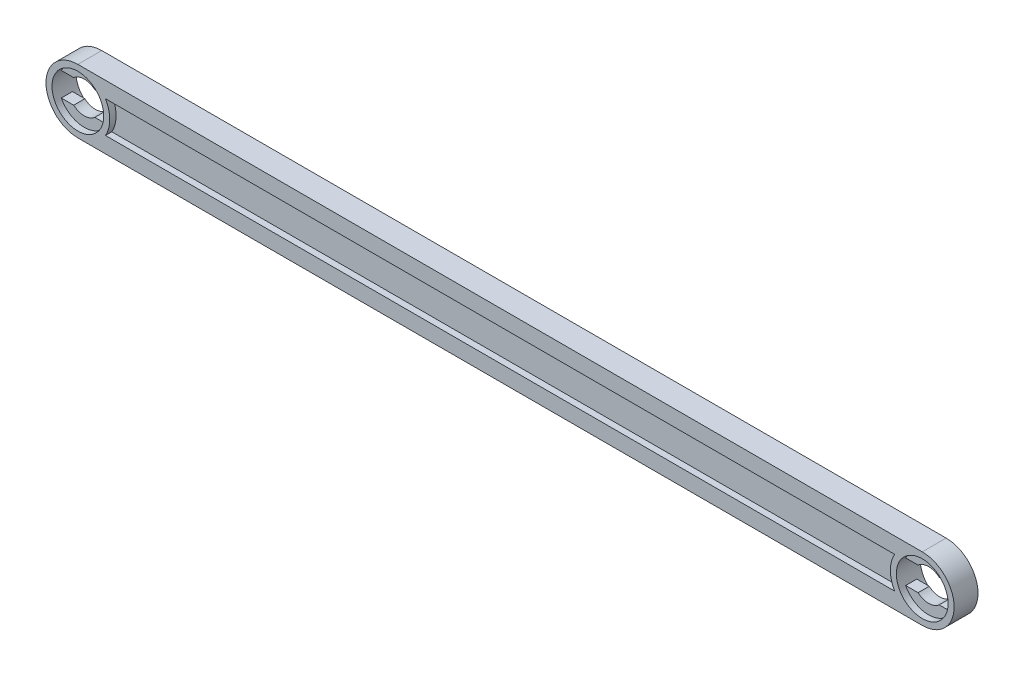
ISO-10303-21;
HEADER;
FILE_DESCRIPTION(('STEP AP214'),'2;1');
FILE_NAME('part.step','',(''),(''),'','','');
FILE_SCHEMA(('AUTOMOTIVE_DESIGN { 1 0 10303 214 1 1 1 1 }'));
ENDSEC;
DATA;
#1=APPLICATION_CONTEXT('core data for automotive mechanical design processes');
#2=APPLICATION_PROTOCOL_DEFINITION('international standard','automotive_design',2000,#1);
#3=PRODUCT_CONTEXT('',#1,'mechanical');
#4=PRODUCT('Part','Part','',(#3));
#5=PRODUCT_RELATED_PRODUCT_CATEGORY('part','',(#4));
#6=PRODUCT_DEFINITION_FORMATION('','',#4);
#7=PRODUCT_DEFINITION_CONTEXT('part definition',#1,'design');
#8=PRODUCT_DEFINITION('design','',#6,#7);
#9=PRODUCT_DEFINITION_SHAPE('','',#8);
#10=(LENGTH_UNIT() NAMED_UNIT(*) SI_UNIT(.MILLI.,.METRE.));
#11=(NAMED_UNIT(*) PLANE_ANGLE_UNIT() SI_UNIT($,.RADIAN.));
#12=(NAMED_UNIT(*) SI_UNIT($,.STERADIAN.) SOLID_ANGLE_UNIT());
#13=UNCERTAINTY_MEASURE_WITH_UNIT(LENGTH_MEASURE(1.E-05),#10,'distance_accuracy_value','');
#14=(GEOMETRIC_REPRESENTATION_CONTEXT(3) GLOBAL_UNCERTAINTY_ASSIGNED_CONTEXT((#13)) GLOBAL_UNIT_ASSIGNED_CONTEXT((#10,
#11,#12)) REPRESENTATION_CONTEXT('',''));
#15=CARTESIAN_POINT('',(0.,0.,0.));
#16=DIRECTION('',(0.,0.,1.));
#17=DIRECTION('',(1.,0.,0.));
#18=AXIS2_PLACEMENT_3D('',#15,#16,#17);
#19=CARTESIAN_POINT('',(0.,0.,-3.));
#20=DIRECTION('',(0.,0.,1.));
#21=DIRECTION('',(1.,0.,0.));
#22=AXIS2_PLACEMENT_3D('',#19,#20,#21);
#23=PLANE('',#22);
#24=DIRECTION('',(0.,-1.,0.));
#25=VECTOR('',#24,1.);
#26=CARTESIAN_POINT('',(102.,-2.,-3.));
#27=LINE('',#26,#25);
#28=CARTESIAN_POINT('',(102.,2.,-3.));
#29=VERTEX_POINT('',#28);
#30=CARTESIAN_POINT('',(102.,-2.,-3.));
#31=VERTEX_POINT('',#30);
#32=EDGE_CURVE('E248',#29,#31,#27,.T.);
#33=ORIENTED_EDGE('',*,*,#32,.F.);
#34=DIRECTION('',(1.,0.,0.));
#35=VECTOR('',#34,1.);
#36=CARTESIAN_POINT('',(102.,2.,-3.));
#37=LINE('',#36,#35);
#38=CARTESIAN_POINT('',(4.,2.,-3.));
#39=VERTEX_POINT('',#38);
#40=EDGE_CURVE('E49',#39,#29,#37,.T.);
#41=ORIENTED_EDGE('',*,*,#40,.F.);
#42=DIRECTION('',(0.,1.,0.));
#43=VECTOR('',#42,1.);
#44=CARTESIAN_POINT('',(4.00000000000003,-2.,-3.));
#45=LINE('',#44,#43);
#46=CARTESIAN_POINT('',(4.00000000000003,-2.,-3.));
#47=VERTEX_POINT('',#46);
#48=EDGE_CURVE('E239',#47,#39,#45,.T.);
#49=ORIENTED_EDGE('',*,*,#48,.F.);
#50=DIRECTION('',(-1.,0.,0.));
#51=VECTOR('',#50,1.);
#52=CARTESIAN_POINT('',(102.,-2.,-3.));
#53=LINE('',#52,#51);
#54=EDGE_CURVE('E242',#31,#47,#53,.T.);
#55=ORIENTED_EDGE('',*,*,#54,.F.);
#56=EDGE_LOOP('',(#33,#41,#49,#55));
#57=FACE_BOUND('',#56,.T.);
#58=CARTESIAN_POINT('',(0.,0.,-3.));
#59=DIRECTION('',(0.,0.,1.));
#60=DIRECTION('',(1.,0.,0.));
#61=AXIS2_PLACEMENT_3D('',#58,#59,#60);
#62=CIRCLE('',#61,4.);
#63=CARTESIAN_POINT('',(0.,4.,-3.));
#64=VERTEX_POINT('',#63);
#65=CARTESIAN_POINT('',(0.,-4.,-3.));
#66=VERTEX_POINT('',#65);
#67=EDGE_CURVE('E414',#64,#66,#62,.T.);
#68=ORIENTED_EDGE('',*,*,#67,.F.);
#69=DIRECTION('',(-1.,0.,0.));
#70=VECTOR('',#69,1.);
#71=CARTESIAN_POINT('',(0.,4.,-3.));
#72=LINE('',#71,#70);
#73=CARTESIAN_POINT('',(106.,4.,-3.));
#74=VERTEX_POINT('',#73);
#75=EDGE_CURVE('E424',#74,#64,#72,.T.);
#76=ORIENTED_EDGE('',*,*,#75,.F.);
#77=CARTESIAN_POINT('',(106.,0.,-3.));
#78=DIRECTION('',(0.,0.,1.));
#79=DIRECTION('',(1.,0.,0.));
#80=AXIS2_PLACEMENT_3D('',#77,#78,#79);
#81=CIRCLE('',#80,4.);
#82=CARTESIAN_POINT('',(106.,-4.,-3.));
#83=VERTEX_POINT('',#82);
#84=EDGE_CURVE('E421',#83,#74,#81,.T.);
#85=ORIENTED_EDGE('',*,*,#84,.F.);
#86=DIRECTION('',(1.,0.,0.));
#87=VECTOR('',#86,1.);
#88=CARTESIAN_POINT('',(0.,-4.,-3.));
#89=LINE('',#88,#87);
#90=EDGE_CURVE('E417',#66,#83,#89,.T.);
#91=ORIENTED_EDGE('',*,*,#90,.F.);
#92=EDGE_LOOP('',(#68,#76,#85,#91));
#93=FACE_BOUND('',#92,.T.);
#94=CARTESIAN_POINT('',(0.,0.,-3.));
#95=DIRECTION('',(0.,0.,1.));
#96=DIRECTION('',(1.,0.,0.));
#97=AXIS2_PLACEMENT_3D('',#94,#95,#96);
#98=CIRCLE('',#97,3.25);
#99=CARTESIAN_POINT('',(3.25,0.,-3.));
#100=VERTEX_POINT('',#99);
#101=EDGE_CURVE('E391',#100,#100,#98,.F.);
#102=ORIENTED_EDGE('',*,*,#101,.F.);
#103=EDGE_LOOP('',(#102));
#104=FACE_BOUND('',#103,.T.);
#105=CARTESIAN_POINT('',(106.,0.,-3.));
#106=DIRECTION('',(0.,0.,1.));
#107=DIRECTION('',(1.,0.,0.));
#108=AXIS2_PLACEMENT_3D('',#105,#106,#107);
#109=CIRCLE('',#108,3.25);
#110=CARTESIAN_POINT('',(109.25,0.,-3.));
#111=VERTEX_POINT('',#110);
#112=EDGE_CURVE('E328',#111,#111,#109,.F.);
#113=ORIENTED_EDGE('',*,*,#112,.F.);
#114=EDGE_LOOP('',(#113));
#115=FACE_BOUND('',#114,.T.);
#116=ADVANCED_FACE('F34',(#57,#93,#104,#115),#23,.F.);
#117=CARTESIAN_POINT('',(103.116859351332,1.5,-3.001));
#118=DIRECTION('',(0.,1.,0.));
#119=DIRECTION('',(0.,0.,1.));
#120=AXIS2_PLACEMENT_3D('',#117,#118,#119);
#121=PLANE('',#120);
#122=DIRECTION('',(0.,0.,1.));
#123=VECTOR('',#122,1.);
#124=CARTESIAN_POINT('',(103.116859351332,1.5,-3.001));
#125=LINE('',#124,#123);
#126=CARTESIAN_POINT('',(103.116859351332,1.5,-2.2));
#127=VERTEX_POINT('',#126);
#128=CARTESIAN_POINT('',(103.116859351332,1.5,-0.8));
#129=VERTEX_POINT('',#128);
#130=EDGE_CURVE('E335',#127,#129,#125,.T.);
#131=ORIENTED_EDGE('',*,*,#130,.F.);
#132=DIRECTION('',(1.,0.,0.));
#133=VECTOR('',#132,1.);
#134=CARTESIAN_POINT('',(103.116859351332,1.5,-2.2));
#135=LINE('',#134,#133);
#136=CARTESIAN_POINT('',(104.677124344468,1.5,-2.2));
#137=VERTEX_POINT('',#136);
#138=EDGE_CURVE('E306',#127,#137,#135,.T.);
#139=ORIENTED_EDGE('',*,*,#138,.T.);
#140=DIRECTION('',(0.,0.,1.));
#141=VECTOR('',#140,1.);
#142=CARTESIAN_POINT('',(104.677124344468,1.5,-3.001));
#143=LINE('',#142,#141);
#144=CARTESIAN_POINT('',(104.677124344468,1.5,-0.8));
#145=VERTEX_POINT('',#144);
#146=EDGE_CURVE('E338',#137,#145,#143,.T.);
#147=ORIENTED_EDGE('',*,*,#146,.T.);
#148=DIRECTION('',(1.,0.,0.));
#149=VECTOR('',#148,1.);
#150=CARTESIAN_POINT('',(103.116859351332,1.5,-0.8));
#151=LINE('',#150,#149);
#152=EDGE_CURVE('E325',#129,#145,#151,.T.);
#153=ORIENTED_EDGE('',*,*,#152,.F.);
#154=EDGE_LOOP('',(#131,#139,#147,#153));
#155=FACE_BOUND('',#154,.T.);
#156=ADVANCED_FACE('F483',(#155),#121,.F.);
#157=CARTESIAN_POINT('',(106.,0.,-3.001));
#158=DIRECTION('',(0.,0.,1.));
#159=DIRECTION('',(1.,0.,0.));
#160=AXIS2_PLACEMENT_3D('',#157,#158,#159);
#161=CYLINDRICAL_SURFACE('',#160,2.);
#162=ORIENTED_EDGE('',*,*,#146,.F.);
#163=CARTESIAN_POINT('',(106.,0.,-2.2));
#164=DIRECTION('',(0.,0.,1.));
#165=DIRECTION('',(1.,0.,0.));
#166=AXIS2_PLACEMENT_3D('',#163,#164,#165);
#167=CIRCLE('',#166,2.);
#168=CARTESIAN_POINT('',(107.322875655532,1.5,-2.2));
#169=VERTEX_POINT('',#168);
#170=EDGE_CURVE('E303',#137,#169,#167,.F.);
#171=ORIENTED_EDGE('',*,*,#170,.T.);
#172=DIRECTION('',(0.,0.,1.));
#173=VECTOR('',#172,1.);
#174=CARTESIAN_POINT('',(107.322875655532,1.5,-3.001));
#175=LINE('',#174,#173);
#176=CARTESIAN_POINT('',(107.322875655532,1.5,-0.800000000000001));
#177=VERTEX_POINT('',#176);
#178=EDGE_CURVE('E340',#169,#177,#175,.T.);
#179=ORIENTED_EDGE('',*,*,#178,.T.);
#180=CARTESIAN_POINT('',(106.,0.,-0.8));
#181=DIRECTION('',(0.,0.,1.));
#182=DIRECTION('',(1.,0.,0.));
#183=AXIS2_PLACEMENT_3D('',#180,#181,#182);
#184=CIRCLE('',#183,2.);
#185=EDGE_CURVE('E322',#145,#177,#184,.F.);
#186=ORIENTED_EDGE('',*,*,#185,.F.);
#187=EDGE_LOOP('',(#162,#171,#179,#186));
#188=FACE_BOUND('',#187,.T.);
#189=ADVANCED_FACE('F489',(#188),#161,.F.);
#190=CARTESIAN_POINT('',(107.322875655532,1.5,-3.001));
#191=DIRECTION('',(0.,1.,0.));
#192=DIRECTION('',(0.,0.,1.));
#193=AXIS2_PLACEMENT_3D('',#190,#191,#192);
#194=PLANE('',#193);
#195=ORIENTED_EDGE('',*,*,#178,.F.);
#196=DIRECTION('',(1.,0.,0.));
#197=VECTOR('',#196,1.);
#198=CARTESIAN_POINT('',(107.322875655532,1.5,-2.2));
#199=LINE('',#198,#197);
#200=CARTESIAN_POINT('',(108.883140648668,1.5,-2.2));
#201=VERTEX_POINT('',#200);
#202=EDGE_CURVE('E300',#169,#201,#199,.T.);
#203=ORIENTED_EDGE('',*,*,#202,.T.);
#204=DIRECTION('',(0.,0.,1.));
#205=VECTOR('',#204,1.);
#206=CARTESIAN_POINT('',(108.883140648668,1.5,-3.001));
#207=LINE('',#206,#205);
#208=CARTESIAN_POINT('',(108.883140648668,1.5,-0.8));
#209=VERTEX_POINT('',#208);
#210=EDGE_CURVE('E342',#201,#209,#207,.T.);
#211=ORIENTED_EDGE('',*,*,#210,.T.);
#212=DIRECTION('',(1.,0.,0.));
#213=VECTOR('',#212,1.);
#214=CARTESIAN_POINT('',(107.322875655532,1.5,-0.8));
#215=LINE('',#214,#213);
#216=EDGE_CURVE('E319',#177,#209,#215,.T.);
#217=ORIENTED_EDGE('',*,*,#216,.F.);
#218=EDGE_LOOP('',(#195,#203,#211,#217));
#219=FACE_BOUND('',#218,.T.);
#220=ADVANCED_FACE('F660',(#219),#194,.F.);
#221=CARTESIAN_POINT('',(107.322875655532,-1.5,-3.001));
#222=DIRECTION('',(0.,-1.,0.));
#223=DIRECTION('',(0.,0.,-1.));
#224=AXIS2_PLACEMENT_3D('',#221,#222,#223);
#225=PLANE('',#224);
#226=DIRECTION('',(0.,0.,1.));
#227=VECTOR('',#226,1.);
#228=CARTESIAN_POINT('',(108.883140648668,-1.5,-3.001));
#229=LINE('',#228,#227);
#230=CARTESIAN_POINT('',(108.883140648668,-1.5,-2.2));
#231=VERTEX_POINT('',#230);
#232=CARTESIAN_POINT('',(108.883140648668,-1.5,-0.8));
#233=VERTEX_POINT('',#232);
#234=EDGE_CURVE('E344',#231,#233,#229,.T.);
#235=ORIENTED_EDGE('',*,*,#234,.F.);
#236=DIRECTION('',(-1.,0.,0.));
#237=VECTOR('',#236,1.);
#238=CARTESIAN_POINT('',(107.322875655532,-1.5,-2.2));
#239=LINE('',#238,#237);
#240=CARTESIAN_POINT('',(107.322875655532,-1.5,-2.2));
#241=VERTEX_POINT('',#240);
#242=EDGE_CURVE('E297',#231,#241,#239,.T.);
#243=ORIENTED_EDGE('',*,*,#242,.T.);
#244=DIRECTION('',(0.,0.,1.));
#245=VECTOR('',#244,1.);
#246=CARTESIAN_POINT('',(107.322875655532,-1.5,-3.001));
#247=LINE('',#246,#245);
#248=CARTESIAN_POINT('',(107.322875655532,-1.5,-0.8));
#249=VERTEX_POINT('',#248);
#250=EDGE_CURVE('E346',#241,#249,#247,.T.);
#251=ORIENTED_EDGE('',*,*,#250,.T.);
#252=DIRECTION('',(-1.,0.,0.));
#253=VECTOR('',#252,1.);
#254=CARTESIAN_POINT('',(107.322875655532,-1.5,-0.8));
#255=LINE('',#254,#253);
#256=EDGE_CURVE('E316',#233,#249,#255,.T.);
#257=ORIENTED_EDGE('',*,*,#256,.F.);
#258=EDGE_LOOP('',(#235,#243,#251,#257));
#259=FACE_BOUND('',#258,.T.);
#260=ADVANCED_FACE('F670',(#259),#225,.F.);
#261=CARTESIAN_POINT('',(106.,0.,-3.001));
#262=DIRECTION('',(0.,0.,1.));
#263=DIRECTION('',(1.,0.,0.));
#264=AXIS2_PLACEMENT_3D('',#261,#262,#263);
#265=CYLINDRICAL_SURFACE('',#264,2.);
#266=ORIENTED_EDGE('',*,*,#250,.F.);
#267=CARTESIAN_POINT('',(106.,0.,-2.2));
#268=DIRECTION('',(0.,0.,1.));
#269=DIRECTION('',(1.,0.,0.));
#270=AXIS2_PLACEMENT_3D('',#267,#268,#269);
#271=CIRCLE('',#270,2.);
#272=CARTESIAN_POINT('',(104.677124344468,-1.5,-2.2));
#273=VERTEX_POINT('',#272);
#274=EDGE_CURVE('E294',#241,#273,#271,.F.);
#275=ORIENTED_EDGE('',*,*,#274,.T.);
#276=DIRECTION('',(0.,0.,1.));
#277=VECTOR('',#276,1.);
#278=CARTESIAN_POINT('',(104.677124344468,-1.5,-3.001));
#279=LINE('',#278,#277);
#280=CARTESIAN_POINT('',(104.677124344468,-1.5,-0.800000000000001));
#281=VERTEX_POINT('',#280);
#282=EDGE_CURVE('E348',#273,#281,#279,.T.);
#283=ORIENTED_EDGE('',*,*,#282,.T.);
#284=CARTESIAN_POINT('',(106.,0.,-0.8));
#285=DIRECTION('',(0.,0.,1.));
#286=DIRECTION('',(1.,0.,0.));
#287=AXIS2_PLACEMENT_3D('',#284,#285,#286);
#288=CIRCLE('',#287,2.);
#289=EDGE_CURVE('E313',#249,#281,#288,.F.);
#290=ORIENTED_EDGE('',*,*,#289,.F.);
#291=EDGE_LOOP('',(#266,#275,#283,#290));
#292=FACE_BOUND('',#291,.T.);
#293=ADVANCED_FACE('F680',(#292),#265,.F.);
#294=CARTESIAN_POINT('',(103.116859351332,-1.5,-3.001));
#295=DIRECTION('',(0.,-1.,0.));
#296=DIRECTION('',(0.,0.,-1.));
#297=AXIS2_PLACEMENT_3D('',#294,#295,#296);
#298=PLANE('',#297);
#299=ORIENTED_EDGE('',*,*,#282,.F.);
#300=DIRECTION('',(-1.,0.,0.));
#301=VECTOR('',#300,1.);
#302=CARTESIAN_POINT('',(103.116859351332,-1.5,-2.2));
#303=LINE('',#302,#301);
#304=CARTESIAN_POINT('',(103.116859351332,-1.5,-2.2));
#305=VERTEX_POINT('',#304);
#306=EDGE_CURVE('E291',#273,#305,#303,.T.);
#307=ORIENTED_EDGE('',*,*,#306,.T.);
#308=DIRECTION('',(0.,0.,1.));
#309=VECTOR('',#308,1.);
#310=CARTESIAN_POINT('',(103.116859351332,-1.5,-3.001));
#311=LINE('',#310,#309);
#312=CARTESIAN_POINT('',(103.116859351332,-1.5,-0.8));
#313=VERTEX_POINT('',#312);
#314=EDGE_CURVE('E334',#305,#313,#311,.T.);
#315=ORIENTED_EDGE('',*,*,#314,.T.);
#316=DIRECTION('',(-1.,0.,0.));
#317=VECTOR('',#316,1.);
#318=CARTESIAN_POINT('',(103.116859351332,-1.5,-0.8));
#319=LINE('',#318,#317);
#320=EDGE_CURVE('E11',#281,#313,#319,.T.);
#321=ORIENTED_EDGE('',*,*,#320,.F.);
#322=EDGE_LOOP('',(#299,#307,#315,#321));
#323=FACE_BOUND('',#322,.T.);
#324=ADVANCED_FACE('F602',(#323),#298,.F.);
#325=CARTESIAN_POINT('',(-2.8831406486677,1.5,-3.001));
#326=DIRECTION('',(0.,1.,0.));
#327=DIRECTION('',(0.,0.,1.));
#328=AXIS2_PLACEMENT_3D('',#325,#326,#327);
#329=PLANE('',#328);
#330=DIRECTION('',(0.,0.,1.));
#331=VECTOR('',#330,1.);
#332=CARTESIAN_POINT('',(-2.8831406486677,1.5,-3.001));
#333=LINE('',#332,#331);
#334=CARTESIAN_POINT('',(-2.8831406486677,1.5,-2.2));
#335=VERTEX_POINT('',#334);
#336=CARTESIAN_POINT('',(-2.8831406486677,1.5,-0.8));
#337=VERTEX_POINT('',#336);
#338=EDGE_CURVE('E398',#335,#337,#333,.T.);
#339=ORIENTED_EDGE('',*,*,#338,.F.);
#340=DIRECTION('',(1.,0.,0.));
#341=VECTOR('',#340,1.);
#342=CARTESIAN_POINT('',(-2.8831406486677,1.5,-2.2));
#343=LINE('',#342,#341);
#344=CARTESIAN_POINT('',(-1.3228756555323,1.5,-2.2));
#345=VERTEX_POINT('',#344);
#346=EDGE_CURVE('E369',#335,#345,#343,.T.);
#347=ORIENTED_EDGE('',*,*,#346,.T.);
#348=DIRECTION('',(0.,0.,1.));
#349=VECTOR('',#348,1.);
#350=CARTESIAN_POINT('',(-1.3228756555323,1.5,-3.001));
#351=LINE('',#350,#349);
#352=CARTESIAN_POINT('',(-1.3228756555323,1.5,-0.8));
#353=VERTEX_POINT('',#352);
#354=EDGE_CURVE('E401',#345,#353,#351,.T.);
#355=ORIENTED_EDGE('',*,*,#354,.T.);
#356=DIRECTION('',(1.,0.,0.));
#357=VECTOR('',#356,1.);
#358=CARTESIAN_POINT('',(-2.8831406486677,1.5,-0.8));
#359=LINE('',#358,#357);
#360=EDGE_CURVE('E388',#337,#353,#359,.T.);
#361=ORIENTED_EDGE('',*,*,#360,.F.);
#362=EDGE_LOOP('',(#339,#347,#355,#361));
#363=FACE_BOUND('',#362,.T.);
#364=ADVANCED_FACE('F538',(#363),#329,.F.);
#365=CARTESIAN_POINT('',(0.,0.,-3.001));
#366=DIRECTION('',(0.,0.,1.));
#367=DIRECTION('',(1.,0.,0.));
#368=AXIS2_PLACEMENT_3D('',#365,#366,#367);
#369=CYLINDRICAL_SURFACE('',#368,2.);
#370=ORIENTED_EDGE('',*,*,#354,.F.);
#371=CARTESIAN_POINT('',(0.,0.,-2.2));
#372=DIRECTION('',(0.,0.,1.));
#373=DIRECTION('',(1.,0.,0.));
#374=AXIS2_PLACEMENT_3D('',#371,#372,#373);
#375=CIRCLE('',#374,2.);
#376=CARTESIAN_POINT('',(1.3228756555323,1.5,-2.2));
#377=VERTEX_POINT('',#376);
#378=EDGE_CURVE('E366',#345,#377,#375,.F.);
#379=ORIENTED_EDGE('',*,*,#378,.T.);
#380=DIRECTION('',(0.,0.,1.));
#381=VECTOR('',#380,1.);
#382=CARTESIAN_POINT('',(1.3228756555323,1.5,-3.001));
#383=LINE('',#382,#381);
#384=CARTESIAN_POINT('',(1.3228756555323,1.5,-0.800000000000001));
#385=VERTEX_POINT('',#384);
#386=EDGE_CURVE('E403',#377,#385,#383,.T.);
#387=ORIENTED_EDGE('',*,*,#386,.T.);
#388=CARTESIAN_POINT('',(0.,0.,-0.8));
#389=DIRECTION('',(0.,0.,1.));
#390=DIRECTION('',(1.,0.,0.));
#391=AXIS2_PLACEMENT_3D('',#388,#389,#390);
#392=CIRCLE('',#391,2.);
#393=EDGE_CURVE('E385',#353,#385,#392,.F.);
#394=ORIENTED_EDGE('',*,*,#393,.F.);
#395=EDGE_LOOP('',(#370,#379,#387,#394));
#396=FACE_BOUND('',#395,.T.);
#397=ADVANCED_FACE('F544',(#396),#369,.F.);
#398=CARTESIAN_POINT('',(1.3228756555323,1.5,-3.001));
#399=DIRECTION('',(0.,1.,0.));
#400=DIRECTION('',(0.,0.,1.));
#401=AXIS2_PLACEMENT_3D('',#398,#399,#400);
#402=PLANE('',#401);
#403=ORIENTED_EDGE('',*,*,#386,.F.);
#404=DIRECTION('',(1.,0.,0.));
#405=VECTOR('',#404,1.);
#406=CARTESIAN_POINT('',(1.3228756555323,1.5,-2.2));
#407=LINE('',#406,#405);
#408=CARTESIAN_POINT('',(2.8831406486677,1.5,-2.2));
#409=VERTEX_POINT('',#408);
#410=EDGE_CURVE('E363',#377,#409,#407,.T.);
#411=ORIENTED_EDGE('',*,*,#410,.T.);
#412=DIRECTION('',(0.,0.,1.));
#413=VECTOR('',#412,1.);
#414=CARTESIAN_POINT('',(2.8831406486677,1.5,-3.001));
#415=LINE('',#414,#413);
#416=CARTESIAN_POINT('',(2.8831406486677,1.5,-0.8));
#417=VERTEX_POINT('',#416);
#418=EDGE_CURVE('E405',#409,#417,#415,.T.);
#419=ORIENTED_EDGE('',*,*,#418,.T.);
#420=DIRECTION('',(1.,0.,0.));
#421=VECTOR('',#420,1.);
#422=CARTESIAN_POINT('',(1.3228756555323,1.5,-0.8));
#423=LINE('',#422,#421);
#424=EDGE_CURVE('E382',#385,#417,#423,.T.);
#425=ORIENTED_EDGE('',*,*,#424,.F.);
#426=EDGE_LOOP('',(#403,#411,#419,#425));
#427=FACE_BOUND('',#426,.T.);
#428=ADVANCED_FACE('F547',(#427),#402,.F.);
#429=CARTESIAN_POINT('',(1.3228756555323,-1.5,-3.001));
#430=DIRECTION('',(0.,-1.,0.));
#431=DIRECTION('',(0.,0.,-1.));
#432=AXIS2_PLACEMENT_3D('',#429,#430,#431);
#433=PLANE('',#432);
#434=DIRECTION('',(0.,0.,1.));
#435=VECTOR('',#434,1.);
#436=CARTESIAN_POINT('',(2.8831406486677,-1.5,-3.001));
#437=LINE('',#436,#435);
#438=CARTESIAN_POINT('',(2.8831406486677,-1.5,-2.2));
#439=VERTEX_POINT('',#438);
#440=CARTESIAN_POINT('',(2.8831406486677,-1.5,-0.8));
#441=VERTEX_POINT('',#440);
#442=EDGE_CURVE('E407',#439,#441,#437,.T.);
#443=ORIENTED_EDGE('',*,*,#442,.F.);
#444=DIRECTION('',(-1.,0.,0.));
#445=VECTOR('',#444,1.);
#446=CARTESIAN_POINT('',(1.3228756555323,-1.5,-2.2));
#447=LINE('',#446,#445);
#448=CARTESIAN_POINT('',(1.32287565553229,-1.5,-2.2));
#449=VERTEX_POINT('',#448);
#450=EDGE_CURVE('E360',#439,#449,#447,.T.);
#451=ORIENTED_EDGE('',*,*,#450,.T.);
#452=DIRECTION('',(0.,0.,1.));
#453=VECTOR('',#452,1.);
#454=CARTESIAN_POINT('',(1.32287565553229,-1.5,-3.001));
#455=LINE('',#454,#453);
#456=CARTESIAN_POINT('',(1.32287565553229,-1.5,-0.8));
#457=VERTEX_POINT('',#456);
#458=EDGE_CURVE('E409',#449,#457,#455,.T.);
#459=ORIENTED_EDGE('',*,*,#458,.T.);
#460=DIRECTION('',(-1.,0.,0.));
#461=VECTOR('',#460,1.);
#462=CARTESIAN_POINT('',(1.3228756555323,-1.5,-0.8));
#463=LINE('',#462,#461);
#464=EDGE_CURVE('E379',#441,#457,#463,.T.);
#465=ORIENTED_EDGE('',*,*,#464,.F.);
#466=EDGE_LOOP('',(#443,#451,#459,#465));
#467=FACE_BOUND('',#466,.T.);
#468=ADVANCED_FACE('F461',(#467),#433,.F.);
#469=CARTESIAN_POINT('',(0.,0.,-3.001));
#470=DIRECTION('',(0.,0.,1.));
#471=DIRECTION('',(1.,0.,0.));
#472=AXIS2_PLACEMENT_3D('',#469,#470,#471);
#473=CYLINDRICAL_SURFACE('',#472,2.);
#474=ORIENTED_EDGE('',*,*,#458,.F.);
#475=CARTESIAN_POINT('',(0.,0.,-2.2));
#476=DIRECTION('',(0.,0.,1.));
#477=DIRECTION('',(1.,0.,0.));
#478=AXIS2_PLACEMENT_3D('',#475,#476,#477);
#479=CIRCLE('',#478,2.);
#480=CARTESIAN_POINT('',(-1.3228756555323,-1.5,-2.2));
#481=VERTEX_POINT('',#480);
#482=EDGE_CURVE('E357',#449,#481,#479,.F.);
#483=ORIENTED_EDGE('',*,*,#482,.T.);
#484=DIRECTION('',(0.,0.,1.));
#485=VECTOR('',#484,1.);
#486=CARTESIAN_POINT('',(-1.3228756555323,-1.5,-3.001));
#487=LINE('',#486,#485);
#488=CARTESIAN_POINT('',(-1.3228756555323,-1.5,-0.800000000000001));
#489=VERTEX_POINT('',#488);
#490=EDGE_CURVE('E411',#481,#489,#487,.T.);
#491=ORIENTED_EDGE('',*,*,#490,.T.);
#492=CARTESIAN_POINT('',(0.,0.,-0.8));
#493=DIRECTION('',(0.,0.,1.));
#494=DIRECTION('',(1.,0.,0.));
#495=AXIS2_PLACEMENT_3D('',#492,#493,#494);
#496=CIRCLE('',#495,2.);
#497=EDGE_CURVE('E376',#457,#489,#496,.F.);
#498=ORIENTED_EDGE('',*,*,#497,.F.);
#499=EDGE_LOOP('',(#474,#483,#491,#498));
#500=FACE_BOUND('',#499,.T.);
#501=ADVANCED_FACE('F464',(#500),#473,.F.);
#502=CARTESIAN_POINT('',(-2.8831406486677,-1.5,-3.001));
#503=DIRECTION('',(0.,-1.,0.));
#504=DIRECTION('',(0.,0.,-1.));
#505=AXIS2_PLACEMENT_3D('',#502,#503,#504);
#506=PLANE('',#505);
#507=ORIENTED_EDGE('',*,*,#490,.F.);
#508=DIRECTION('',(-1.,0.,0.));
#509=VECTOR('',#508,1.);
#510=CARTESIAN_POINT('',(-2.8831406486677,-1.5,-2.2));
#511=LINE('',#510,#509);
#512=CARTESIAN_POINT('',(-2.8831406486677,-1.5,-2.2));
#513=VERTEX_POINT('',#512);
#514=EDGE_CURVE('E354',#481,#513,#511,.T.);
#515=ORIENTED_EDGE('',*,*,#514,.T.);
#516=DIRECTION('',(0.,0.,1.));
#517=VECTOR('',#516,1.);
#518=CARTESIAN_POINT('',(-2.8831406486677,-1.5,-3.001));
#519=LINE('',#518,#517);
#520=CARTESIAN_POINT('',(-2.8831406486677,-1.5,-0.8));
#521=VERTEX_POINT('',#520);
#522=EDGE_CURVE('E397',#513,#521,#519,.T.);
#523=ORIENTED_EDGE('',*,*,#522,.T.);
#524=DIRECTION('',(-1.,0.,0.));
#525=VECTOR('',#524,1.);
#526=CARTESIAN_POINT('',(-2.8831406486677,-1.5,-0.8));
#527=LINE('',#526,#525);
#528=EDGE_CURVE('E42',#489,#521,#527,.T.);
#529=ORIENTED_EDGE('',*,*,#528,.F.);
#530=EDGE_LOOP('',(#507,#515,#523,#529));
#531=FACE_BOUND('',#530,.T.);
#532=ADVANCED_FACE('F465',(#531),#506,.F.);
#533=CARTESIAN_POINT('',(0.,0.,-3.));
#534=DIRECTION('',(0.,0.,1.));
#535=DIRECTION('',(1.,0.,0.));
#536=AXIS2_PLACEMENT_3D('',#533,#534,#535);
#537=CYLINDRICAL_SURFACE('',#536,4.);
#538=CARTESIAN_POINT('',(0.,0.,0.));
#539=DIRECTION('',(0.,0.,1.));
#540=DIRECTION('',(1.,0.,0.));
#541=AXIS2_PLACEMENT_3D('',#538,#539,#540);
#542=CIRCLE('',#541,4.);
#543=CARTESIAN_POINT('',(0.,4.,0.));
#544=VERTEX_POINT('',#543);
#545=CARTESIAN_POINT('',(0.,-4.,0.));
#546=VERTEX_POINT('',#545);
#547=EDGE_CURVE('E400',#544,#546,#542,.T.);
#548=ORIENTED_EDGE('',*,*,#547,.F.);
#549=DIRECTION('',(0.,0.,1.));
#550=VECTOR('',#549,1.);
#551=CARTESIAN_POINT('',(0.,4.,-3.));
#552=LINE('',#551,#550);
#553=EDGE_CURVE('E438',#64,#544,#552,.T.);
#554=ORIENTED_EDGE('',*,*,#553,.F.);
#555=ORIENTED_EDGE('',*,*,#67,.T.);
#556=DIRECTION('',(0.,0.,1.));
#557=VECTOR('',#556,1.);
#558=CARTESIAN_POINT('',(0.,-4.,-3.));
#559=LINE('',#558,#557);
#560=EDGE_CURVE('E427',#66,#546,#559,.T.);
#561=ORIENTED_EDGE('',*,*,#560,.T.);
#562=EDGE_LOOP('',(#548,#554,#555,#561));
#563=FACE_BOUND('',#562,.T.);
#564=ADVANCED_FACE('F36',(#563),#537,.T.);
#565=CARTESIAN_POINT('',(0.,4.,-3.));
#566=DIRECTION('',(0.,1.,0.));
#567=DIRECTION('',(0.,0.,1.));
#568=AXIS2_PLACEMENT_3D('',#565,#566,#567);
#569=PLANE('',#568);
#570=DIRECTION('',(-1.,0.,0.));
#571=VECTOR('',#570,1.);
#572=CARTESIAN_POINT('',(0.,4.,0.));
#573=LINE('',#572,#571);
#574=CARTESIAN_POINT('',(106.,4.,0.));
#575=VERTEX_POINT('',#574);
#576=EDGE_CURVE('E418',#575,#544,#573,.T.);
#577=ORIENTED_EDGE('',*,*,#576,.F.);
#578=DIRECTION('',(0.,0.,1.));
#579=VECTOR('',#578,1.);
#580=CARTESIAN_POINT('',(106.,4.,-3.));
#581=LINE('',#580,#579);
#582=EDGE_CURVE('E440',#74,#575,#581,.T.);
#583=ORIENTED_EDGE('',*,*,#582,.F.);
#584=ORIENTED_EDGE('',*,*,#75,.T.);
#585=ORIENTED_EDGE('',*,*,#553,.T.);
#586=EDGE_LOOP('',(#577,#583,#584,#585));
#587=FACE_BOUND('',#586,.T.);
#588=ADVANCED_FACE('F501',(#587),#569,.T.);
#589=CARTESIAN_POINT('',(106.,0.,-3.));
#590=DIRECTION('',(0.,0.,1.));
#591=DIRECTION('',(1.,0.,0.));
#592=AXIS2_PLACEMENT_3D('',#589,#590,#591);
#593=CYLINDRICAL_SURFACE('',#592,4.);
#594=CARTESIAN_POINT('',(106.,0.,0.));
#595=DIRECTION('',(0.,0.,1.));
#596=DIRECTION('',(1.,0.,0.));
#597=AXIS2_PLACEMENT_3D('',#594,#595,#596);
#598=CIRCLE('',#597,4.);
#599=CARTESIAN_POINT('',(106.,-4.,0.));
#600=VERTEX_POINT('',#599);
#601=EDGE_CURVE('E433',#600,#575,#598,.T.);
#602=ORIENTED_EDGE('',*,*,#601,.F.);
#603=DIRECTION('',(0.,0.,1.));
#604=VECTOR('',#603,1.);
#605=CARTESIAN_POINT('',(106.,-4.,-3.));
#606=LINE('',#605,#604);
#607=EDGE_CURVE('E442',#83,#600,#606,.T.);
#608=ORIENTED_EDGE('',*,*,#607,.F.);
#609=ORIENTED_EDGE('',*,*,#84,.T.);
#610=ORIENTED_EDGE('',*,*,#582,.T.);
#611=EDGE_LOOP('',(#602,#608,#609,#610));
#612=FACE_BOUND('',#611,.T.);
#613=ADVANCED_FACE('F504',(#612),#593,.T.);
#614=CARTESIAN_POINT('',(0.,-4.,-3.));
#615=DIRECTION('',(0.,-1.,0.));
#616=DIRECTION('',(0.,0.,-1.));
#617=AXIS2_PLACEMENT_3D('',#614,#615,#616);
#618=PLANE('',#617);
#619=DIRECTION('',(1.,0.,0.));
#620=VECTOR('',#619,1.);
#621=CARTESIAN_POINT('',(0.,-4.,0.));
#622=LINE('',#621,#620);
#623=EDGE_CURVE('E430',#546,#600,#622,.T.);
#624=ORIENTED_EDGE('',*,*,#623,.F.);
#625=ORIENTED_EDGE('',*,*,#560,.F.);
#626=ORIENTED_EDGE('',*,*,#90,.T.);
#627=ORIENTED_EDGE('',*,*,#607,.T.);
#628=EDGE_LOOP('',(#624,#625,#626,#627));
#629=FACE_BOUND('',#628,.T.);
#630=ADVANCED_FACE('F499',(#629),#618,.T.);
#631=CARTESIAN_POINT('',(0.,0.,0.));
#632=DIRECTION('',(0.,0.,1.));
#633=DIRECTION('',(1.,0.,0.));
#634=AXIS2_PLACEMENT_3D('',#631,#632,#633);
#635=PLANE('',#634);
#636=CARTESIAN_POINT('',(0.,0.,0.));
#637=DIRECTION('',(0.,0.,-1.));
#638=DIRECTION('',(1.,0.,0.));
#639=AXIS2_PLACEMENT_3D('',#636,#637,#638);
#640=CIRCLE('',#639,4.);
#641=CARTESIAN_POINT('',(3.46410161513775,2.,0.));
#642=VERTEX_POINT('',#641);
#643=CARTESIAN_POINT('',(3.46410161513775,-2.,0.));
#644=VERTEX_POINT('',#643);
#645=EDGE_CURVE('E57',#642,#644,#640,.T.);
#646=ORIENTED_EDGE('',*,*,#645,.F.);
#647=DIRECTION('',(-1.,0.,0.));
#648=VECTOR('',#647,1.);
#649=CARTESIAN_POINT('',(3.46410161513775,2.,0.));
#650=LINE('',#649,#648);
#651=CARTESIAN_POINT('',(102.535898384862,2.00000000000001,0.));
#652=VERTEX_POINT('',#651);
#653=EDGE_CURVE('E261',#652,#642,#650,.T.);
#654=ORIENTED_EDGE('',*,*,#653,.F.);
#655=CARTESIAN_POINT('',(106.,0.,0.));
#656=DIRECTION('',(0.,0.,-1.));
#657=DIRECTION('',(1.,0.,0.));
#658=AXIS2_PLACEMENT_3D('',#655,#656,#657);
#659=CIRCLE('',#658,4.);
#660=CARTESIAN_POINT('',(102.535898384862,-2.00000000000001,0.));
#661=VERTEX_POINT('',#660);
#662=EDGE_CURVE('E275',#661,#652,#659,.T.);
#663=ORIENTED_EDGE('',*,*,#662,.F.);
#664=DIRECTION('',(1.,0.,0.));
#665=VECTOR('',#664,1.);
#666=CARTESIAN_POINT('',(3.46410161513775,-2.,0.));
#667=LINE('',#666,#665);
#668=EDGE_CURVE('E272',#644,#661,#667,.T.);
#669=ORIENTED_EDGE('',*,*,#668,.F.);
#670=EDGE_LOOP('',(#646,#654,#663,#669));
#671=FACE_BOUND('',#670,.T.);
#672=CARTESIAN_POINT('',(106.,0.,0.));
#673=DIRECTION('',(0.,0.,1.));
#674=DIRECTION('',(1.,0.,0.));
#675=AXIS2_PLACEMENT_3D('',#672,#673,#674);
#676=CIRCLE('',#675,3.25);
#677=CARTESIAN_POINT('',(109.25,0.,0.));
#678=VERTEX_POINT('',#677);
#679=EDGE_CURVE('E331',#678,#678,#676,.T.);
#680=ORIENTED_EDGE('',*,*,#679,.F.);
#681=EDGE_LOOP('',(#680));
#682=FACE_BOUND('',#681,.T.);
#683=CARTESIAN_POINT('',(0.,0.,0.));
#684=DIRECTION('',(0.,0.,1.));
#685=DIRECTION('',(1.,0.,0.));
#686=AXIS2_PLACEMENT_3D('',#683,#684,#685);
#687=CIRCLE('',#686,3.25);
#688=CARTESIAN_POINT('',(3.25,0.,0.));
#689=VERTEX_POINT('',#688);
#690=EDGE_CURVE('E394',#689,#689,#687,.T.);
#691=ORIENTED_EDGE('',*,*,#690,.F.);
#692=EDGE_LOOP('',(#691));
#693=FACE_BOUND('',#692,.T.);
#694=ORIENTED_EDGE('',*,*,#547,.T.);
#695=ORIENTED_EDGE('',*,*,#623,.T.);
#696=ORIENTED_EDGE('',*,*,#601,.T.);
#697=ORIENTED_EDGE('',*,*,#576,.T.);
#698=EDGE_LOOP('',(#694,#695,#696,#697));
#699=FACE_BOUND('',#698,.T.);
#700=ADVANCED_FACE('F496',(#671,#682,#693,#699),#635,.T.);
#701=CARTESIAN_POINT('',(0.,0.,-3.001));
#702=DIRECTION('',(0.,0.,1.));
#703=DIRECTION('',(1.,0.,0.));
#704=AXIS2_PLACEMENT_3D('',#701,#702,#703);
#705=CYLINDRICAL_SURFACE('',#704,3.25);
#706=CARTESIAN_POINT('',(0.,0.,-2.2));
#707=DIRECTION('',(0.,0.,1.));
#708=DIRECTION('',(1.,0.,0.));
#709=AXIS2_PLACEMENT_3D('',#706,#707,#708);
#710=CIRCLE('',#709,3.25);
#711=EDGE_CURVE('E351',#409,#335,#710,.T.);
#712=ORIENTED_EDGE('',*,*,#711,.T.);
#713=ORIENTED_EDGE('',*,*,#338,.T.);
#714=CARTESIAN_POINT('',(0.,0.,-0.8));
#715=DIRECTION('',(0.,0.,1.));
#716=DIRECTION('',(1.,0.,0.));
#717=AXIS2_PLACEMENT_3D('',#714,#715,#716);
#718=CIRCLE('',#717,3.25);
#719=EDGE_CURVE('E373',#417,#337,#718,.T.);
#720=ORIENTED_EDGE('',*,*,#719,.F.);
#721=ORIENTED_EDGE('',*,*,#418,.F.);
#722=EDGE_LOOP('',(#712,#713,#720,#721));
#723=FACE_BOUND('',#722,.T.);
#724=EDGE_CURVE('E337',#513,#439,#710,.T.);
#725=ORIENTED_EDGE('',*,*,#724,.T.);
#726=ORIENTED_EDGE('',*,*,#442,.T.);
#727=EDGE_CURVE('E372',#521,#441,#718,.T.);
#728=ORIENTED_EDGE('',*,*,#727,.F.);
#729=ORIENTED_EDGE('',*,*,#522,.F.);
#730=EDGE_LOOP('',(#725,#726,#728,#729));
#731=FACE_BOUND('',#730,.T.);
#732=ORIENTED_EDGE('',*,*,#690,.T.);
#733=EDGE_LOOP('',(#732));
#734=FACE_BOUND('',#733,.T.);
#735=ORIENTED_EDGE('',*,*,#101,.T.);
#736=EDGE_LOOP('',(#735));
#737=FACE_BOUND('',#736,.T.);
#738=ADVANCED_FACE('F457',(#723,#731,#734,#737),#705,.F.);
#739=CARTESIAN_POINT('',(0.,0.,-0.8));
#740=DIRECTION('',(0.,0.,1.));
#741=DIRECTION('',(1.,0.,0.));
#742=AXIS2_PLACEMENT_3D('',#739,#740,#741);
#743=PLANE('',#742);
#744=ORIENTED_EDGE('',*,*,#464,.T.);
#745=ORIENTED_EDGE('',*,*,#497,.T.);
#746=ORIENTED_EDGE('',*,*,#528,.T.);
#747=ORIENTED_EDGE('',*,*,#727,.T.);
#748=EDGE_LOOP('',(#744,#745,#746,#747));
#749=FACE_BOUND('',#748,.T.);
#750=ADVANCED_FACE('F449',(#749),#743,.T.);
#751=ORIENTED_EDGE('',*,*,#360,.T.);
#752=ORIENTED_EDGE('',*,*,#393,.T.);
#753=ORIENTED_EDGE('',*,*,#424,.T.);
#754=ORIENTED_EDGE('',*,*,#719,.T.);
#755=EDGE_LOOP('',(#751,#752,#753,#754));
#756=FACE_BOUND('',#755,.T.);
#757=ADVANCED_FACE('F479',(#756),#743,.T.);
#758=CARTESIAN_POINT('',(0.,0.,-2.2));
#759=DIRECTION('',(0.,0.,1.));
#760=DIRECTION('',(1.,0.,0.));
#761=AXIS2_PLACEMENT_3D('',#758,#759,#760);
#762=PLANE('',#761);
#763=ORIENTED_EDGE('',*,*,#711,.F.);
#764=ORIENTED_EDGE('',*,*,#410,.F.);
#765=ORIENTED_EDGE('',*,*,#378,.F.);
#766=ORIENTED_EDGE('',*,*,#346,.F.);
#767=EDGE_LOOP('',(#763,#764,#765,#766));
#768=FACE_BOUND('',#767,.T.);
#769=ADVANCED_FACE('F470',(#768),#762,.F.);
#770=ORIENTED_EDGE('',*,*,#724,.F.);
#771=ORIENTED_EDGE('',*,*,#514,.F.);
#772=ORIENTED_EDGE('',*,*,#482,.F.);
#773=ORIENTED_EDGE('',*,*,#450,.F.);
#774=EDGE_LOOP('',(#770,#771,#772,#773));
#775=FACE_BOUND('',#774,.T.);
#776=ADVANCED_FACE('F467',(#775),#762,.F.);
#777=CARTESIAN_POINT('',(106.,0.,-3.001));
#778=DIRECTION('',(0.,0.,1.));
#779=DIRECTION('',(1.,0.,0.));
#780=AXIS2_PLACEMENT_3D('',#777,#778,#779);
#781=CYLINDRICAL_SURFACE('',#780,3.25);
#782=CARTESIAN_POINT('',(106.,0.,-2.2));
#783=DIRECTION('',(0.,0.,1.));
#784=DIRECTION('',(1.,0.,0.));
#785=AXIS2_PLACEMENT_3D('',#782,#783,#784);
#786=CIRCLE('',#785,3.25);
#787=EDGE_CURVE('E288',#201,#127,#786,.T.);
#788=ORIENTED_EDGE('',*,*,#787,.T.);
#789=ORIENTED_EDGE('',*,*,#130,.T.);
#790=CARTESIAN_POINT('',(106.,0.,-0.8));
#791=DIRECTION('',(0.,0.,1.));
#792=DIRECTION('',(1.,0.,0.));
#793=AXIS2_PLACEMENT_3D('',#790,#791,#792);
#794=CIRCLE('',#793,3.25);
#795=EDGE_CURVE('E310',#209,#129,#794,.T.);
#796=ORIENTED_EDGE('',*,*,#795,.F.);
#797=ORIENTED_EDGE('',*,*,#210,.F.);
#798=EDGE_LOOP('',(#788,#789,#796,#797));
#799=FACE_BOUND('',#798,.T.);
#800=EDGE_CURVE('E282',#305,#231,#786,.T.);
#801=ORIENTED_EDGE('',*,*,#800,.T.);
#802=ORIENTED_EDGE('',*,*,#234,.T.);
#803=EDGE_CURVE('E309',#313,#233,#794,.T.);
#804=ORIENTED_EDGE('',*,*,#803,.F.);
#805=ORIENTED_EDGE('',*,*,#314,.F.);
#806=EDGE_LOOP('',(#801,#802,#804,#805));
#807=FACE_BOUND('',#806,.T.);
#808=ORIENTED_EDGE('',*,*,#679,.T.);
#809=EDGE_LOOP('',(#808));
#810=FACE_BOUND('',#809,.T.);
#811=ORIENTED_EDGE('',*,*,#112,.T.);
#812=EDGE_LOOP('',(#811));
#813=FACE_BOUND('',#812,.T.);
#814=ADVANCED_FACE('F469',(#799,#807,#810,#813),#781,.F.);
#815=CARTESIAN_POINT('',(106.,0.,-0.8));
#816=DIRECTION('',(0.,0.,1.));
#817=DIRECTION('',(1.,0.,0.));
#818=AXIS2_PLACEMENT_3D('',#815,#816,#817);
#819=PLANE('',#818);
#820=ORIENTED_EDGE('',*,*,#256,.T.);
#821=ORIENTED_EDGE('',*,*,#289,.T.);
#822=ORIENTED_EDGE('',*,*,#320,.T.);
#823=ORIENTED_EDGE('',*,*,#803,.T.);
#824=EDGE_LOOP('',(#820,#821,#822,#823));
#825=FACE_BOUND('',#824,.T.);
#826=ADVANCED_FACE('F476',(#825),#819,.T.);
#827=ORIENTED_EDGE('',*,*,#152,.T.);
#828=ORIENTED_EDGE('',*,*,#185,.T.);
#829=ORIENTED_EDGE('',*,*,#216,.T.);
#830=ORIENTED_EDGE('',*,*,#795,.T.);
#831=EDGE_LOOP('',(#827,#828,#829,#830));
#832=FACE_BOUND('',#831,.T.);
#833=ADVANCED_FACE('F716',(#832),#819,.T.);
#834=CARTESIAN_POINT('',(106.,0.,-2.2));
#835=DIRECTION('',(0.,0.,1.));
#836=DIRECTION('',(1.,0.,0.));
#837=AXIS2_PLACEMENT_3D('',#834,#835,#836);
#838=PLANE('',#837);
#839=ORIENTED_EDGE('',*,*,#787,.F.);
#840=ORIENTED_EDGE('',*,*,#202,.F.);
#841=ORIENTED_EDGE('',*,*,#170,.F.);
#842=ORIENTED_EDGE('',*,*,#138,.F.);
#843=EDGE_LOOP('',(#839,#840,#841,#842));
#844=FACE_BOUND('',#843,.T.);
#845=ADVANCED_FACE('F726',(#844),#838,.F.);
#846=ORIENTED_EDGE('',*,*,#800,.F.);
#847=ORIENTED_EDGE('',*,*,#306,.F.);
#848=ORIENTED_EDGE('',*,*,#274,.F.);
#849=ORIENTED_EDGE('',*,*,#242,.F.);
#850=EDGE_LOOP('',(#846,#847,#848,#849));
#851=FACE_BOUND('',#850,.T.);
#852=ADVANCED_FACE('F734',(#851),#838,.F.);
#853=CARTESIAN_POINT('',(0.,0.,-0.8));
#854=DIRECTION('',(0.,0.,1.));
#855=DIRECTION('',(1.,0.,0.));
#856=AXIS2_PLACEMENT_3D('',#853,#854,#855);
#857=CYLINDRICAL_SURFACE('',#856,4.);
#858=ORIENTED_EDGE('',*,*,#645,.T.);
#859=DIRECTION('',(0.,0.,1.));
#860=VECTOR('',#859,1.);
#861=CARTESIAN_POINT('',(3.46410161513775,-2.,-0.8));
#862=LINE('',#861,#860);
#863=CARTESIAN_POINT('',(3.46410161513775,-2.,-0.8));
#864=VERTEX_POINT('',#863);
#865=EDGE_CURVE('E270',#864,#644,#862,.T.);
#866=ORIENTED_EDGE('',*,*,#865,.F.);
#867=CARTESIAN_POINT('',(0.,0.,-0.8));
#868=DIRECTION('',(0.,0.,-1.));
#869=DIRECTION('',(1.,0.,0.));
#870=AXIS2_PLACEMENT_3D('',#867,#868,#869);
#871=CIRCLE('',#870,4.);
#872=CARTESIAN_POINT('',(3.46410161513775,2.,-0.8));
#873=VERTEX_POINT('',#872);
#874=EDGE_CURVE('E257',#873,#864,#871,.T.);
#875=ORIENTED_EDGE('',*,*,#874,.F.);
#876=DIRECTION('',(0.,0.,1.));
#877=VECTOR('',#876,1.);
#878=CARTESIAN_POINT('',(3.46410161513775,2.,-0.8));
#879=LINE('',#878,#877);
#880=EDGE_CURVE('E280',#873,#642,#879,.T.);
#881=ORIENTED_EDGE('',*,*,#880,.T.);
#882=EDGE_LOOP('',(#858,#866,#875,#881));
#883=FACE_BOUND('',#882,.T.);
#884=ADVANCED_FACE('F744',(#883),#857,.T.);
#885=CARTESIAN_POINT('',(3.46410161513775,2.,-0.8));
#886=DIRECTION('',(0.,1.,0.));
#887=DIRECTION('',(-1.,0.,0.));
#888=AXIS2_PLACEMENT_3D('',#885,#886,#887);
#889=PLANE('',#888);
#890=ORIENTED_EDGE('',*,*,#653,.T.);
#891=ORIENTED_EDGE('',*,*,#880,.F.);
#892=DIRECTION('',(-1.,0.,0.));
#893=VECTOR('',#892,1.);
#894=CARTESIAN_POINT('',(3.46410161513775,2.,-0.8));
#895=LINE('',#894,#893);
#896=CARTESIAN_POINT('',(102.535898384862,2.00000000000001,-0.8));
#897=VERTEX_POINT('',#896);
#898=EDGE_CURVE('E267',#897,#873,#895,.T.);
#899=ORIENTED_EDGE('',*,*,#898,.F.);
#900=DIRECTION('',(0.,0.,1.));
#901=VECTOR('',#900,1.);
#902=CARTESIAN_POINT('',(102.535898384862,2.00000000000001,-0.8));
#903=LINE('',#902,#901);
#904=EDGE_CURVE('E283',#897,#652,#903,.T.);
#905=ORIENTED_EDGE('',*,*,#904,.T.);
#906=EDGE_LOOP('',(#890,#891,#899,#905));
#907=FACE_BOUND('',#906,.T.);
#908=ADVANCED_FACE('F758',(#907),#889,.F.);
#909=CARTESIAN_POINT('',(106.,0.,-0.8));
#910=DIRECTION('',(0.,0.,1.));
#911=DIRECTION('',(1.,0.,0.));
#912=AXIS2_PLACEMENT_3D('',#909,#910,#911);
#913=CYLINDRICAL_SURFACE('',#912,4.);
#914=ORIENTED_EDGE('',*,*,#662,.T.);
#915=ORIENTED_EDGE('',*,*,#904,.F.);
#916=CARTESIAN_POINT('',(106.,0.,-0.8));
#917=DIRECTION('',(0.,0.,-1.));
#918=DIRECTION('',(1.,0.,0.));
#919=AXIS2_PLACEMENT_3D('',#916,#917,#918);
#920=CIRCLE('',#919,4.);
#921=CARTESIAN_POINT('',(102.535898384862,-2.00000000000001,-0.8));
#922=VERTEX_POINT('',#921);
#923=EDGE_CURVE('E264',#922,#897,#920,.T.);
#924=ORIENTED_EDGE('',*,*,#923,.F.);
#925=DIRECTION('',(0.,0.,1.));
#926=VECTOR('',#925,1.);
#927=CARTESIAN_POINT('',(102.535898384862,-2.00000000000001,-0.8));
#928=LINE('',#927,#926);
#929=EDGE_CURVE('E285',#922,#661,#928,.T.);
#930=ORIENTED_EDGE('',*,*,#929,.T.);
#931=EDGE_LOOP('',(#914,#915,#924,#930));
#932=FACE_BOUND('',#931,.T.);
#933=ADVANCED_FACE('F767',(#932),#913,.T.);
#934=CARTESIAN_POINT('',(3.46410161513775,-2.,-0.8));
#935=DIRECTION('',(0.,-1.,0.));
#936=DIRECTION('',(1.,0.,0.));
#937=AXIS2_PLACEMENT_3D('',#934,#935,#936);
#938=PLANE('',#937);
#939=ORIENTED_EDGE('',*,*,#668,.T.);
#940=ORIENTED_EDGE('',*,*,#929,.F.);
#941=DIRECTION('',(1.,0.,0.));
#942=VECTOR('',#941,1.);
#943=CARTESIAN_POINT('',(3.46410161513775,-2.,-0.8));
#944=LINE('',#943,#942);
#945=EDGE_CURVE('E260',#864,#922,#944,.T.);
#946=ORIENTED_EDGE('',*,*,#945,.F.);
#947=ORIENTED_EDGE('',*,*,#865,.T.);
#948=EDGE_LOOP('',(#939,#940,#946,#947));
#949=FACE_BOUND('',#948,.T.);
#950=ADVANCED_FACE('F777',(#949),#938,.F.);
#951=CARTESIAN_POINT('',(0.,0.,-0.8));
#952=DIRECTION('',(0.,0.,1.));
#953=DIRECTION('',(1.,0.,0.));
#954=AXIS2_PLACEMENT_3D('',#951,#952,#953);
#955=PLANE('',#954);
#956=ORIENTED_EDGE('',*,*,#874,.T.);
#957=ORIENTED_EDGE('',*,*,#945,.T.);
#958=ORIENTED_EDGE('',*,*,#923,.T.);
#959=ORIENTED_EDGE('',*,*,#898,.T.);
#960=EDGE_LOOP('',(#956,#957,#958,#959));
#961=FACE_BOUND('',#960,.T.);
#962=ADVANCED_FACE('F787',(#961),#955,.T.);
#963=CARTESIAN_POINT('',(102.,2.,-2.2));
#964=DIRECTION('',(0.,1.,0.));
#965=DIRECTION('',(0.,0.,1.));
#966=AXIS2_PLACEMENT_3D('',#963,#964,#965);
#967=PLANE('',#966);
#968=ORIENTED_EDGE('',*,*,#40,.T.);
#969=DIRECTION('',(0.,0.,-1.));
#970=VECTOR('',#969,1.);
#971=CARTESIAN_POINT('',(102.,2.,-2.2));
#972=LINE('',#971,#970);
#973=CARTESIAN_POINT('',(102.,2.,-2.2));
#974=VERTEX_POINT('',#973);
#975=EDGE_CURVE('E217',#974,#29,#972,.T.);
#976=ORIENTED_EDGE('',*,*,#975,.F.);
#977=DIRECTION('',(1.,0.,0.));
#978=VECTOR('',#977,1.);
#979=CARTESIAN_POINT('',(102.,2.,-2.2));
#980=LINE('',#979,#978);
#981=CARTESIAN_POINT('',(4.,2.,-2.2));
#982=VERTEX_POINT('',#981);
#983=EDGE_CURVE('E221',#982,#974,#980,.T.);
#984=ORIENTED_EDGE('',*,*,#983,.F.);
#985=DIRECTION('',(0.,0.,-1.));
#986=VECTOR('',#985,1.);
#987=CARTESIAN_POINT('',(4.,2.,-2.2));
#988=LINE('',#987,#986);
#989=EDGE_CURVE('E252',#982,#39,#988,.T.);
#990=ORIENTED_EDGE('',*,*,#989,.T.);
#991=EDGE_LOOP('',(#968,#976,#984,#990));
#992=FACE_BOUND('',#991,.T.);
#993=ADVANCED_FACE('F219',(#992),#967,.F.);
#994=CARTESIAN_POINT('',(4.00000000000003,-2.,-2.2));
#995=DIRECTION('',(-1.,0.,0.));
#996=DIRECTION('',(0.,-1.,0.));
#997=AXIS2_PLACEMENT_3D('',#994,#995,#996);
#998=PLANE('',#997);
#999=ORIENTED_EDGE('',*,*,#48,.T.);
#1000=ORIENTED_EDGE('',*,*,#989,.F.);
#1001=DIRECTION('',(0.,1.,0.));
#1002=VECTOR('',#1001,1.);
#1003=CARTESIAN_POINT('',(4.00000000000003,-2.,-2.2));
#1004=LINE('',#1003,#1002);
#1005=CARTESIAN_POINT('',(4.00000000000003,-2.,-2.2));
#1006=VERTEX_POINT('',#1005);
#1007=EDGE_CURVE('E227',#1006,#982,#1004,.T.);
#1008=ORIENTED_EDGE('',*,*,#1007,.F.);
#1009=DIRECTION('',(0.,0.,-1.));
#1010=VECTOR('',#1009,1.);
#1011=CARTESIAN_POINT('',(4.00000000000003,-2.,-2.2));
#1012=LINE('',#1011,#1010);
#1013=EDGE_CURVE('E254',#1006,#47,#1012,.T.);
#1014=ORIENTED_EDGE('',*,*,#1013,.T.);
#1015=EDGE_LOOP('',(#999,#1000,#1008,#1014));
#1016=FACE_BOUND('',#1015,.T.);
#1017=ADVANCED_FACE('F809',(#1016),#998,.F.);
#1018=CARTESIAN_POINT('',(102.,-2.,-2.2));
#1019=DIRECTION('',(0.,-1.,0.));
#1020=DIRECTION('',(0.,0.,-1.));
#1021=AXIS2_PLACEMENT_3D('',#1018,#1019,#1020);
#1022=PLANE('',#1021);
#1023=ORIENTED_EDGE('',*,*,#54,.T.);
#1024=ORIENTED_EDGE('',*,*,#1013,.F.);
#1025=DIRECTION('',(-1.,0.,0.));
#1026=VECTOR('',#1025,1.);
#1027=CARTESIAN_POINT('',(102.,-2.,-2.2));
#1028=LINE('',#1027,#1026);
#1029=CARTESIAN_POINT('',(102.,-2.,-2.2));
#1030=VERTEX_POINT('',#1029);
#1031=EDGE_CURVE('E235',#1030,#1006,#1028,.T.);
#1032=ORIENTED_EDGE('',*,*,#1031,.F.);
#1033=DIRECTION('',(0.,0.,-1.));
#1034=VECTOR('',#1033,1.);
#1035=CARTESIAN_POINT('',(102.,-2.,-2.2));
#1036=LINE('',#1035,#1034);
#1037=EDGE_CURVE('E226',#1030,#31,#1036,.T.);
#1038=ORIENTED_EDGE('',*,*,#1037,.T.);
#1039=EDGE_LOOP('',(#1023,#1024,#1032,#1038));
#1040=FACE_BOUND('',#1039,.T.);
#1041=ADVANCED_FACE('F818',(#1040),#1022,.F.);
#1042=CARTESIAN_POINT('',(102.,-2.,-2.2));
#1043=DIRECTION('',(1.,0.,0.));
#1044=DIRECTION('',(0.,0.,-1.));
#1045=AXIS2_PLACEMENT_3D('',#1042,#1043,#1044);
#1046=PLANE('',#1045);
#1047=ORIENTED_EDGE('',*,*,#32,.T.);
#1048=ORIENTED_EDGE('',*,*,#1037,.F.);
#1049=DIRECTION('',(0.,-1.,0.));
#1050=VECTOR('',#1049,1.);
#1051=CARTESIAN_POINT('',(102.,-2.,-2.2));
#1052=LINE('',#1051,#1050);
#1053=EDGE_CURVE('E230',#974,#1030,#1052,.T.);
#1054=ORIENTED_EDGE('',*,*,#1053,.F.);
#1055=ORIENTED_EDGE('',*,*,#975,.T.);
#1056=EDGE_LOOP('',(#1047,#1048,#1054,#1055));
#1057=FACE_BOUND('',#1056,.T.);
#1058=ADVANCED_FACE('F231',(#1057),#1046,.F.);
#1059=CARTESIAN_POINT('',(0.,0.,-2.2));
#1060=DIRECTION('',(0.,0.,-1.));
#1061=DIRECTION('',(-1.,0.,0.));
#1062=AXIS2_PLACEMENT_3D('',#1059,#1060,#1061);
#1063=PLANE('',#1062);
#1064=ORIENTED_EDGE('',*,*,#983,.T.);
#1065=ORIENTED_EDGE('',*,*,#1053,.T.);
#1066=ORIENTED_EDGE('',*,*,#1031,.T.);
#1067=ORIENTED_EDGE('',*,*,#1007,.T.);
#1068=EDGE_LOOP('',(#1064,#1065,#1066,#1067));
#1069=FACE_BOUND('',#1068,.T.);
#1070=ADVANCED_FACE('F237',(#1069),#1063,.T.);
#1071=CLOSED_SHELL('',(#116,#156,#189,#220,#260,#293,#324,#364,#397,#428,#468,#501,#532,#564,
#588,#613,#630,#700,#738,#750,#757,#769,#776,#814,#826,#833,#845,#852,#884,#908,#933,#950,#962,
#993,#1017,#1041,#1058,#1070));
#1072=MANIFOLD_SOLID_BREP('B2',#1071);
#1073=ADVANCED_BREP_SHAPE_REPRESENTATION('',(#18,#1072),#14);
#1074=SHAPE_DEFINITION_REPRESENTATION(#9,#1073);
ENDSEC;
END-ISO-10303-21;
